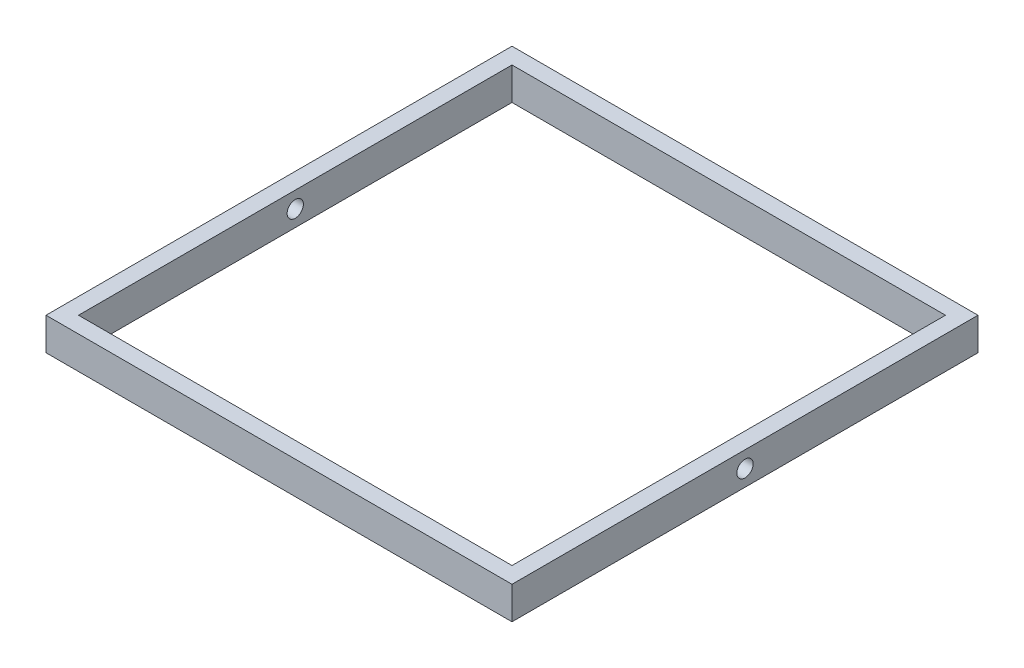
ISO-10303-21;
HEADER;
FILE_DESCRIPTION(('STEP AP214'),'2;1');
FILE_NAME('part.step','',(''),(''),'','','');
FILE_SCHEMA(('AUTOMOTIVE_DESIGN { 1 0 10303 214 1 1 1 1 }'));
ENDSEC;
DATA;
#1=APPLICATION_CONTEXT('core data for automotive mechanical design processes');
#2=APPLICATION_PROTOCOL_DEFINITION('international standard','automotive_design',2000,#1);
#3=PRODUCT_CONTEXT('',#1,'mechanical');
#4=PRODUCT('Part','Part','',(#3));
#5=PRODUCT_RELATED_PRODUCT_CATEGORY('part','',(#4));
#6=PRODUCT_DEFINITION_FORMATION('','',#4);
#7=PRODUCT_DEFINITION_CONTEXT('part definition',#1,'design');
#8=PRODUCT_DEFINITION('design','',#6,#7);
#9=PRODUCT_DEFINITION_SHAPE('','',#8);
#10=(LENGTH_UNIT() NAMED_UNIT(*) SI_UNIT(.MILLI.,.METRE.));
#11=(NAMED_UNIT(*) PLANE_ANGLE_UNIT() SI_UNIT($,.RADIAN.));
#12=(NAMED_UNIT(*) SI_UNIT($,.STERADIAN.) SOLID_ANGLE_UNIT());
#13=UNCERTAINTY_MEASURE_WITH_UNIT(LENGTH_MEASURE(1.E-05),#10,'distance_accuracy_value','');
#14=(GEOMETRIC_REPRESENTATION_CONTEXT(3) GLOBAL_UNCERTAINTY_ASSIGNED_CONTEXT((#13)) GLOBAL_UNIT_ASSIGNED_CONTEXT((#10,
#11,#12)) REPRESENTATION_CONTEXT('',''));
#15=CARTESIAN_POINT('',(0.,0.,0.));
#16=DIRECTION('',(0.,0.,1.));
#17=DIRECTION('',(1.,0.,0.));
#18=AXIS2_PLACEMENT_3D('',#15,#16,#17);
#19=CARTESIAN_POINT('',(0.,6.,0.));
#20=DIRECTION('',(0.,1.,0.));
#21=DIRECTION('',(0.,0.,1.));
#22=AXIS2_PLACEMENT_3D('',#19,#20,#21);
#23=PLANE('',#22);
#24=DIRECTION('',(0.,0.,1.));
#25=VECTOR('',#24,1.);
#26=CARTESIAN_POINT('',(-43.220557938241,6.,0.));
#27=LINE('',#26,#25);
#28=CARTESIAN_POINT('',(-43.220557938241,6.,-43.));
#29=VERTEX_POINT('',#28);
#30=CARTESIAN_POINT('',(-43.220557938241,6.,43.));
#31=VERTEX_POINT('',#30);
#32=EDGE_CURVE('E161',#29,#31,#27,.T.);
#33=ORIENTED_EDGE('',*,*,#32,.T.);
#34=DIRECTION('',(1.,0.,0.));
#35=VECTOR('',#34,1.);
#36=CARTESIAN_POINT('',(0.,6.,43.));
#37=LINE('',#36,#35);
#38=CARTESIAN_POINT('',(42.779442061759,6.,43.));
#39=VERTEX_POINT('',#38);
#40=EDGE_CURVE('E164',#31,#39,#37,.T.);
#41=ORIENTED_EDGE('',*,*,#40,.T.);
#42=DIRECTION('',(0.,0.,-1.));
#43=VECTOR('',#42,1.);
#44=CARTESIAN_POINT('',(42.779442061759,6.,0.));
#45=LINE('',#44,#43);
#46=CARTESIAN_POINT('',(42.779442061759,6.,-43.));
#47=VERTEX_POINT('',#46);
#48=EDGE_CURVE('E167',#39,#47,#45,.T.);
#49=ORIENTED_EDGE('',*,*,#48,.T.);
#50=DIRECTION('',(-1.,0.,0.));
#51=VECTOR('',#50,1.);
#52=CARTESIAN_POINT('',(0.,6.,-43.));
#53=LINE('',#52,#51);
#54=EDGE_CURVE('E169',#47,#29,#53,.T.);
#55=ORIENTED_EDGE('',*,*,#54,.T.);
#56=EDGE_LOOP('',(#33,#41,#49,#55));
#57=FACE_BOUND('',#56,.T.);
#58=DIRECTION('',(1.,0.,0.));
#59=VECTOR('',#58,1.);
#60=CARTESIAN_POINT('',(-40.220557938241,6.,40.));
#61=LINE('',#60,#59);
#62=CARTESIAN_POINT('',(-40.220557938241,6.,40.));
#63=VERTEX_POINT('',#62);
#64=CARTESIAN_POINT('',(39.779442061759,6.,40.));
#65=VERTEX_POINT('',#64);
#66=EDGE_CURVE('E131',#63,#65,#61,.T.);
#67=ORIENTED_EDGE('',*,*,#66,.F.);
#68=DIRECTION('',(0.,0.,1.));
#69=VECTOR('',#68,1.);
#70=CARTESIAN_POINT('',(-40.220557938241,6.,40.));
#71=LINE('',#70,#69);
#72=CARTESIAN_POINT('',(-40.220557938241,6.,-40.));
#73=VERTEX_POINT('',#72);
#74=EDGE_CURVE('E123',#73,#63,#71,.T.);
#75=ORIENTED_EDGE('',*,*,#74,.F.);
#76=DIRECTION('',(-1.,0.,0.));
#77=VECTOR('',#76,1.);
#78=CARTESIAN_POINT('',(-40.220557938241,6.,-40.));
#79=LINE('',#78,#77);
#80=CARTESIAN_POINT('',(39.779442061759,6.,-40.));
#81=VERTEX_POINT('',#80);
#82=EDGE_CURVE('E145',#81,#73,#79,.T.);
#83=ORIENTED_EDGE('',*,*,#82,.F.);
#84=DIRECTION('',(0.,0.,-1.));
#85=VECTOR('',#84,1.);
#86=CARTESIAN_POINT('',(39.779442061759,6.,40.));
#87=LINE('',#86,#85);
#88=EDGE_CURVE('E143',#65,#81,#87,.T.);
#89=ORIENTED_EDGE('',*,*,#88,.F.);
#90=EDGE_LOOP('',(#67,#75,#83,#89));
#91=FACE_BOUND('',#90,.T.);
#92=ADVANCED_FACE('F57',(#57,#91),#23,.T.);
#93=CARTESIAN_POINT('',(0.,0.,0.));
#94=DIRECTION('',(0.,1.,0.));
#95=DIRECTION('',(0.,0.,1.));
#96=AXIS2_PLACEMENT_3D('',#93,#94,#95);
#97=PLANE('',#96);
#98=DIRECTION('',(0.,0.,1.));
#99=VECTOR('',#98,1.);
#100=CARTESIAN_POINT('',(-43.220557938241,0.,0.));
#101=LINE('',#100,#99);
#102=CARTESIAN_POINT('',(-43.220557938241,0.,-43.));
#103=VERTEX_POINT('',#102);
#104=CARTESIAN_POINT('',(-43.220557938241,0.,43.));
#105=VERTEX_POINT('',#104);
#106=EDGE_CURVE('E139',#103,#105,#101,.T.);
#107=ORIENTED_EDGE('',*,*,#106,.F.);
#108=DIRECTION('',(-1.,0.,0.));
#109=VECTOR('',#108,1.);
#110=CARTESIAN_POINT('',(0.,0.,-43.));
#111=LINE('',#110,#109);
#112=CARTESIAN_POINT('',(42.779442061759,0.,-43.));
#113=VERTEX_POINT('',#112);
#114=EDGE_CURVE('E165',#113,#103,#111,.T.);
#115=ORIENTED_EDGE('',*,*,#114,.F.);
#116=DIRECTION('',(0.,0.,-1.));
#117=VECTOR('',#116,1.);
#118=CARTESIAN_POINT('',(42.779442061759,0.,0.));
#119=LINE('',#118,#117);
#120=CARTESIAN_POINT('',(42.779442061759,0.,43.));
#121=VERTEX_POINT('',#120);
#122=EDGE_CURVE('E176',#121,#113,#119,.T.);
#123=ORIENTED_EDGE('',*,*,#122,.F.);
#124=DIRECTION('',(1.,0.,0.));
#125=VECTOR('',#124,1.);
#126=CARTESIAN_POINT('',(0.,0.,43.));
#127=LINE('',#126,#125);
#128=EDGE_CURVE('E174',#105,#121,#127,.T.);
#129=ORIENTED_EDGE('',*,*,#128,.F.);
#130=EDGE_LOOP('',(#107,#115,#123,#129));
#131=FACE_BOUND('',#130,.T.);
#132=DIRECTION('',(0.,0.,1.));
#133=VECTOR('',#132,1.);
#134=CARTESIAN_POINT('',(-40.220557938241,0.,40.));
#135=LINE('',#134,#133);
#136=CARTESIAN_POINT('',(-40.220557938241,0.,-40.));
#137=VERTEX_POINT('',#136);
#138=CARTESIAN_POINT('',(-40.220557938241,0.,40.));
#139=VERTEX_POINT('',#138);
#140=EDGE_CURVE('E81',#137,#139,#135,.T.);
#141=ORIENTED_EDGE('',*,*,#140,.T.);
#142=DIRECTION('',(1.,0.,0.));
#143=VECTOR('',#142,1.);
#144=CARTESIAN_POINT('',(-40.220557938241,0.,40.));
#145=LINE('',#144,#143);
#146=CARTESIAN_POINT('',(39.779442061759,0.,40.));
#147=VERTEX_POINT('',#146);
#148=EDGE_CURVE('E138',#139,#147,#145,.T.);
#149=ORIENTED_EDGE('',*,*,#148,.T.);
#150=DIRECTION('',(0.,0.,-1.));
#151=VECTOR('',#150,1.);
#152=CARTESIAN_POINT('',(39.779442061759,0.,40.));
#153=LINE('',#152,#151);
#154=CARTESIAN_POINT('',(39.779442061759,0.,-40.));
#155=VERTEX_POINT('',#154);
#156=EDGE_CURVE('E153',#147,#155,#153,.T.);
#157=ORIENTED_EDGE('',*,*,#156,.T.);
#158=DIRECTION('',(-1.,0.,0.));
#159=VECTOR('',#158,1.);
#160=CARTESIAN_POINT('',(-40.220557938241,0.,-40.));
#161=LINE('',#160,#159);
#162=EDGE_CURVE('E132',#155,#137,#161,.T.);
#163=ORIENTED_EDGE('',*,*,#162,.T.);
#164=EDGE_LOOP('',(#141,#149,#157,#163));
#165=FACE_BOUND('',#164,.T.);
#166=ADVANCED_FACE('F195',(#131,#165),#97,.F.);
#167=CARTESIAN_POINT('',(-43.220557938241,6.,0.));
#168=DIRECTION('',(1.,0.,0.));
#169=DIRECTION('',(0.,0.,-1.));
#170=AXIS2_PLACEMENT_3D('',#167,#168,#169);
#171=PLANE('',#170);
#172=CARTESIAN_POINT('',(-43.220557938241,3.,0.));
#173=DIRECTION('',(-1.,0.,0.));
#174=DIRECTION('',(0.,0.,1.));
#175=AXIS2_PLACEMENT_3D('',#172,#173,#174);
#176=CIRCLE('',#175,1.5);
#177=CARTESIAN_POINT('',(-43.220557938241,3.,1.50000000000004));
#178=VERTEX_POINT('',#177);
#179=EDGE_CURVE('E240',#178,#178,#176,.T.);
#180=ORIENTED_EDGE('',*,*,#179,.F.);
#181=EDGE_LOOP('',(#180));
#182=FACE_BOUND('',#181,.T.);
#183=ORIENTED_EDGE('',*,*,#106,.T.);
#184=DIRECTION('',(0.,-1.,0.));
#185=VECTOR('',#184,1.);
#186=CARTESIAN_POINT('',(-43.220557938241,6.,43.));
#187=LINE('',#186,#185);
#188=EDGE_CURVE('E12',#31,#105,#187,.T.);
#189=ORIENTED_EDGE('',*,*,#188,.F.);
#190=ORIENTED_EDGE('',*,*,#32,.F.);
#191=DIRECTION('',(0.,-1.,0.));
#192=VECTOR('',#191,1.);
#193=CARTESIAN_POINT('',(-43.220557938241,6.,-43.));
#194=LINE('',#193,#192);
#195=EDGE_CURVE('E171',#29,#103,#194,.T.);
#196=ORIENTED_EDGE('',*,*,#195,.T.);
#197=EDGE_LOOP('',(#183,#189,#190,#196));
#198=FACE_BOUND('',#197,.T.);
#199=ADVANCED_FACE('F59',(#182,#198),#171,.F.);
#200=CARTESIAN_POINT('',(0.,6.,43.));
#201=DIRECTION('',(0.,0.,-1.));
#202=DIRECTION('',(-1.,0.,0.));
#203=AXIS2_PLACEMENT_3D('',#200,#201,#202);
#204=PLANE('',#203);
#205=ORIENTED_EDGE('',*,*,#128,.T.);
#206=DIRECTION('',(0.,-1.,0.));
#207=VECTOR('',#206,1.);
#208=CARTESIAN_POINT('',(42.779442061759,6.,43.));
#209=LINE('',#208,#207);
#210=EDGE_CURVE('E66',#39,#121,#209,.T.);
#211=ORIENTED_EDGE('',*,*,#210,.F.);
#212=ORIENTED_EDGE('',*,*,#40,.F.);
#213=ORIENTED_EDGE('',*,*,#188,.T.);
#214=EDGE_LOOP('',(#205,#211,#212,#213));
#215=FACE_BOUND('',#214,.T.);
#216=ADVANCED_FACE('F205',(#215),#204,.F.);
#217=CARTESIAN_POINT('',(42.779442061759,6.,0.));
#218=DIRECTION('',(-1.,0.,0.));
#219=DIRECTION('',(0.,0.,1.));
#220=AXIS2_PLACEMENT_3D('',#217,#218,#219);
#221=PLANE('',#220);
#222=CARTESIAN_POINT('',(42.7794420617591,3.,0.));
#223=DIRECTION('',(-1.,0.,0.));
#224=DIRECTION('',(0.,0.,1.));
#225=AXIS2_PLACEMENT_3D('',#222,#223,#224);
#226=CIRCLE('',#225,1.5);
#227=CARTESIAN_POINT('',(42.7794420617591,3.,1.5));
#228=VERTEX_POINT('',#227);
#229=EDGE_CURVE('E236',#228,#228,#226,.T.);
#230=ORIENTED_EDGE('',*,*,#229,.T.);
#231=EDGE_LOOP('',(#230));
#232=FACE_BOUND('',#231,.T.);
#233=ORIENTED_EDGE('',*,*,#122,.T.);
#234=DIRECTION('',(0.,-1.,0.));
#235=VECTOR('',#234,1.);
#236=CARTESIAN_POINT('',(42.779442061759,6.,-43.));
#237=LINE('',#236,#235);
#238=EDGE_CURVE('E181',#47,#113,#237,.T.);
#239=ORIENTED_EDGE('',*,*,#238,.F.);
#240=ORIENTED_EDGE('',*,*,#48,.F.);
#241=ORIENTED_EDGE('',*,*,#210,.T.);
#242=EDGE_LOOP('',(#233,#239,#240,#241));
#243=FACE_BOUND('',#242,.T.);
#244=ADVANCED_FACE('F189',(#232,#243),#221,.F.);
#245=CARTESIAN_POINT('',(0.,6.,-43.));
#246=DIRECTION('',(0.,0.,1.));
#247=DIRECTION('',(1.,0.,0.));
#248=AXIS2_PLACEMENT_3D('',#245,#246,#247);
#249=PLANE('',#248);
#250=ORIENTED_EDGE('',*,*,#114,.T.);
#251=ORIENTED_EDGE('',*,*,#195,.F.);
#252=ORIENTED_EDGE('',*,*,#54,.F.);
#253=ORIENTED_EDGE('',*,*,#238,.T.);
#254=EDGE_LOOP('',(#250,#251,#252,#253));
#255=FACE_BOUND('',#254,.T.);
#256=ADVANCED_FACE('F199',(#255),#249,.F.);
#257=CARTESIAN_POINT('',(-40.220557938241,6.,40.));
#258=DIRECTION('',(1.,0.,0.));
#259=DIRECTION('',(0.,0.,-1.));
#260=AXIS2_PLACEMENT_3D('',#257,#258,#259);
#261=PLANE('',#260);
#262=CARTESIAN_POINT('',(-40.220557938241,3.,0.));
#263=DIRECTION('',(1.,0.,0.));
#264=DIRECTION('',(0.,0.,-1.));
#265=AXIS2_PLACEMENT_3D('',#262,#263,#264);
#266=CIRCLE('',#265,1.5);
#267=CARTESIAN_POINT('',(-40.220557938241,3.,-1.49999999999997));
#268=VERTEX_POINT('',#267);
#269=EDGE_CURVE('E151',#268,#268,#266,.T.);
#270=ORIENTED_EDGE('',*,*,#269,.F.);
#271=EDGE_LOOP('',(#270));
#272=FACE_BOUND('',#271,.T.);
#273=ORIENTED_EDGE('',*,*,#140,.F.);
#274=DIRECTION('',(0.,-1.,0.));
#275=VECTOR('',#274,1.);
#276=CARTESIAN_POINT('',(-40.220557938241,6.,-40.));
#277=LINE('',#276,#275);
#278=EDGE_CURVE('E127',#73,#137,#277,.T.);
#279=ORIENTED_EDGE('',*,*,#278,.F.);
#280=ORIENTED_EDGE('',*,*,#74,.T.);
#281=DIRECTION('',(0.,-1.,0.));
#282=VECTOR('',#281,1.);
#283=CARTESIAN_POINT('',(-40.220557938241,6.,40.));
#284=LINE('',#283,#282);
#285=EDGE_CURVE('E126',#63,#139,#284,.T.);
#286=ORIENTED_EDGE('',*,*,#285,.T.);
#287=EDGE_LOOP('',(#273,#279,#280,#286));
#288=FACE_BOUND('',#287,.T.);
#289=ADVANCED_FACE('F125',(#272,#288),#261,.T.);
#290=CARTESIAN_POINT('',(-40.220557938241,6.,40.));
#291=DIRECTION('',(0.,0.,-1.));
#292=DIRECTION('',(-1.,0.,0.));
#293=AXIS2_PLACEMENT_3D('',#290,#291,#292);
#294=PLANE('',#293);
#295=ORIENTED_EDGE('',*,*,#148,.F.);
#296=ORIENTED_EDGE('',*,*,#285,.F.);
#297=ORIENTED_EDGE('',*,*,#66,.T.);
#298=DIRECTION('',(0.,-1.,0.));
#299=VECTOR('',#298,1.);
#300=CARTESIAN_POINT('',(39.779442061759,6.,40.));
#301=LINE('',#300,#299);
#302=EDGE_CURVE('E140',#65,#147,#301,.T.);
#303=ORIENTED_EDGE('',*,*,#302,.T.);
#304=EDGE_LOOP('',(#295,#296,#297,#303));
#305=FACE_BOUND('',#304,.T.);
#306=ADVANCED_FACE('F135',(#305),#294,.T.);
#307=CARTESIAN_POINT('',(39.779442061759,6.,40.));
#308=DIRECTION('',(-1.,0.,0.));
#309=DIRECTION('',(0.,0.,1.));
#310=AXIS2_PLACEMENT_3D('',#307,#308,#309);
#311=PLANE('',#310);
#312=CARTESIAN_POINT('',(39.779442061759,3.,0.));
#313=DIRECTION('',(-1.,0.,0.));
#314=DIRECTION('',(0.,0.,1.));
#315=AXIS2_PLACEMENT_3D('',#312,#313,#314);
#316=CIRCLE('',#315,1.5);
#317=CARTESIAN_POINT('',(39.779442061759,3.,1.5));
#318=VERTEX_POINT('',#317);
#319=EDGE_CURVE('E61',#318,#318,#316,.T.);
#320=ORIENTED_EDGE('',*,*,#319,.F.);
#321=EDGE_LOOP('',(#320));
#322=FACE_BOUND('',#321,.T.);
#323=ORIENTED_EDGE('',*,*,#156,.F.);
#324=ORIENTED_EDGE('',*,*,#302,.F.);
#325=ORIENTED_EDGE('',*,*,#88,.T.);
#326=DIRECTION('',(0.,-1.,0.));
#327=VECTOR('',#326,1.);
#328=CARTESIAN_POINT('',(39.779442061759,6.,-40.));
#329=LINE('',#328,#327);
#330=EDGE_CURVE('E73',#81,#155,#329,.T.);
#331=ORIENTED_EDGE('',*,*,#330,.T.);
#332=EDGE_LOOP('',(#323,#324,#325,#331));
#333=FACE_BOUND('',#332,.T.);
#334=ADVANCED_FACE('F231',(#322,#333),#311,.T.);
#335=CARTESIAN_POINT('',(-40.220557938241,6.,-40.));
#336=DIRECTION('',(0.,0.,1.));
#337=DIRECTION('',(1.,0.,0.));
#338=AXIS2_PLACEMENT_3D('',#335,#336,#337);
#339=PLANE('',#338);
#340=ORIENTED_EDGE('',*,*,#162,.F.);
#341=ORIENTED_EDGE('',*,*,#330,.F.);
#342=ORIENTED_EDGE('',*,*,#82,.T.);
#343=ORIENTED_EDGE('',*,*,#278,.T.);
#344=EDGE_LOOP('',(#340,#341,#342,#343));
#345=FACE_BOUND('',#344,.T.);
#346=ADVANCED_FACE('F251',(#345),#339,.T.);
#347=CARTESIAN_POINT('',(42.7794420617591,3.,0.));
#348=DIRECTION('',(-1.,0.,0.));
#349=DIRECTION('',(0.,0.,1.));
#350=AXIS2_PLACEMENT_3D('',#347,#348,#349);
#351=CYLINDRICAL_SURFACE('',#350,1.5);
#352=ORIENTED_EDGE('',*,*,#319,.T.);
#353=EDGE_LOOP('',(#352));
#354=FACE_BOUND('',#353,.T.);
#355=ORIENTED_EDGE('',*,*,#229,.F.);
#356=EDGE_LOOP('',(#355));
#357=FACE_BOUND('',#356,.T.);
#358=ADVANCED_FACE('F246',(#354,#357),#351,.F.);
#359=ORIENTED_EDGE('',*,*,#269,.T.);
#360=EDGE_LOOP('',(#359));
#361=FACE_BOUND('',#360,.T.);
#362=ORIENTED_EDGE('',*,*,#179,.T.);
#363=EDGE_LOOP('',(#362));
#364=FACE_BOUND('',#363,.T.);
#365=ADVANCED_FACE('F244',(#361,#364),#351,.F.);
#366=CLOSED_SHELL('',(#92,#166,#199,#216,#244,#256,#289,#306,#334,#346,#358,#365));
#367=MANIFOLD_SOLID_BREP('B2',#366);
#368=ADVANCED_BREP_SHAPE_REPRESENTATION('',(#18,#367),#14);
#369=SHAPE_DEFINITION_REPRESENTATION(#9,#368);
ENDSEC;
END-ISO-10303-21;
